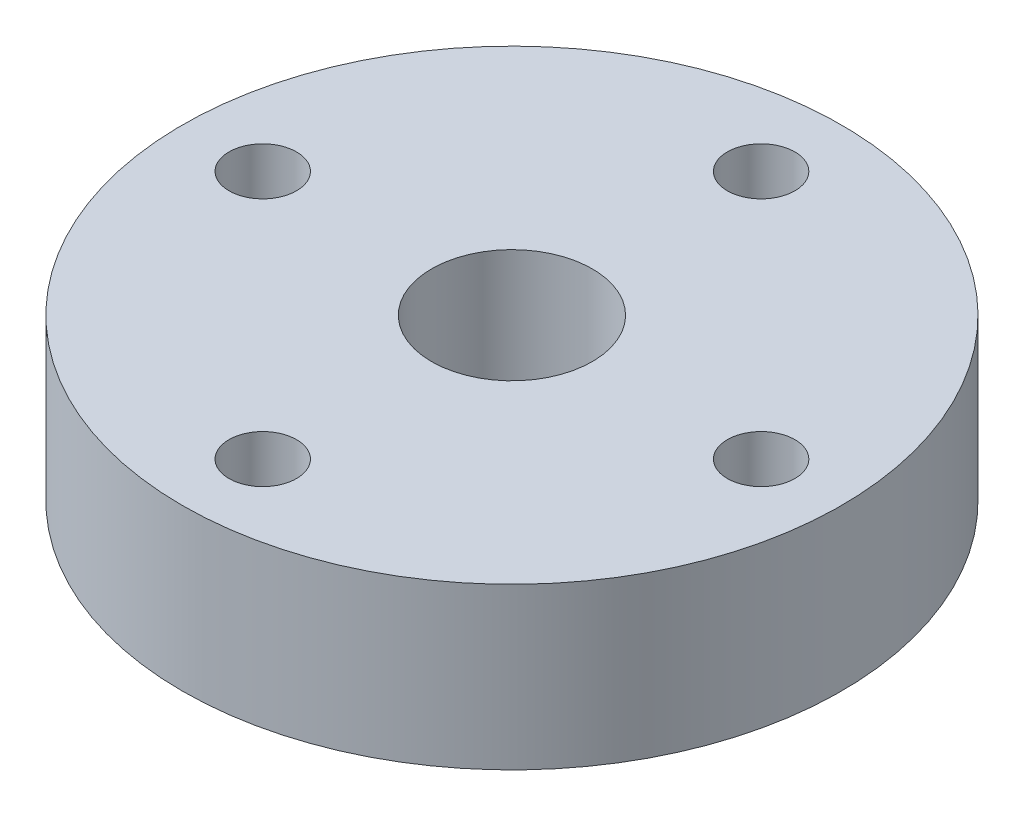
ISO-10303-21;
HEADER;
FILE_DESCRIPTION(('STEP AP214'),'2;1');
FILE_NAME('part.step','',(''),(''),'','','');
FILE_SCHEMA(('AUTOMOTIVE_DESIGN { 1 0 10303 214 1 1 1 1 }'));
ENDSEC;
DATA;
#1=APPLICATION_CONTEXT('core data for automotive mechanical design processes');
#2=APPLICATION_PROTOCOL_DEFINITION('international standard','automotive_design',2000,#1);
#3=PRODUCT_CONTEXT('',#1,'mechanical');
#4=PRODUCT('Part','Part','',(#3));
#5=PRODUCT_RELATED_PRODUCT_CATEGORY('part','',(#4));
#6=PRODUCT_DEFINITION_FORMATION('','',#4);
#7=PRODUCT_DEFINITION_CONTEXT('part definition',#1,'design');
#8=PRODUCT_DEFINITION('design','',#6,#7);
#9=PRODUCT_DEFINITION_SHAPE('','',#8);
#10=(LENGTH_UNIT() NAMED_UNIT(*) SI_UNIT(.MILLI.,.METRE.));
#11=(NAMED_UNIT(*) PLANE_ANGLE_UNIT() SI_UNIT($,.RADIAN.));
#12=(NAMED_UNIT(*) SI_UNIT($,.STERADIAN.) SOLID_ANGLE_UNIT());
#13=UNCERTAINTY_MEASURE_WITH_UNIT(LENGTH_MEASURE(1.E-05),#10,'distance_accuracy_value','');
#14=(GEOMETRIC_REPRESENTATION_CONTEXT(3) GLOBAL_UNCERTAINTY_ASSIGNED_CONTEXT((#13)) GLOBAL_UNIT_ASSIGNED_CONTEXT((#10,
#11,#12)) REPRESENTATION_CONTEXT('',''));
#15=CARTESIAN_POINT('',(0.,0.,0.));
#16=DIRECTION('',(0.,0.,1.));
#17=DIRECTION('',(1.,0.,0.));
#18=AXIS2_PLACEMENT_3D('',#15,#16,#17);
#19=CARTESIAN_POINT('',(0.,10.,0.));
#20=DIRECTION('',(0.,1.,0.));
#21=DIRECTION('',(0.,0.,1.));
#22=AXIS2_PLACEMENT_3D('',#19,#20,#21);
#23=PLANE('',#22);
#24=CARTESIAN_POINT('',(1.58665590856608E-12,10.,15.5));
#25=DIRECTION('',(0.,1.,0.));
#26=DIRECTION('',(0.,0.,1.));
#27=AXIS2_PLACEMENT_3D('',#24,#25,#26);
#28=CIRCLE('',#27,2.1);
#29=CARTESIAN_POINT('',(1.58665590856608E-12,10.,17.6));
#30=VERTEX_POINT('',#29);
#31=EDGE_CURVE('E61',#30,#30,#28,.T.);
#32=ORIENTED_EDGE('',*,*,#31,.F.);
#33=EDGE_LOOP('',(#32));
#34=FACE_BOUND('',#33,.T.);
#35=CARTESIAN_POINT('',(0.,10.,-15.5));
#36=DIRECTION('',(0.,1.,0.));
#37=DIRECTION('',(0.,0.,1.));
#38=AXIS2_PLACEMENT_3D('',#35,#36,#37);
#39=CIRCLE('',#38,2.1);
#40=CARTESIAN_POINT('',(0.,10.,-13.4));
#41=VERTEX_POINT('',#40);
#42=EDGE_CURVE('E49',#41,#41,#39,.T.);
#43=ORIENTED_EDGE('',*,*,#42,.F.);
#44=EDGE_LOOP('',(#43));
#45=FACE_BOUND('',#44,.T.);
#46=CARTESIAN_POINT('',(0.,10.,0.));
#47=DIRECTION('',(0.,1.,0.));
#48=DIRECTION('',(0.,0.,1.));
#49=AXIS2_PLACEMENT_3D('',#46,#47,#48);
#50=CIRCLE('',#49,20.5);
#51=CARTESIAN_POINT('',(0.,10.,20.5));
#52=VERTEX_POINT('',#51);
#53=EDGE_CURVE('E10',#52,#52,#50,.T.);
#54=ORIENTED_EDGE('',*,*,#53,.T.);
#55=EDGE_LOOP('',(#54));
#56=FACE_BOUND('',#55,.T.);
#57=CARTESIAN_POINT('',(0.,10.,0.));
#58=DIRECTION('',(0.,1.,0.));
#59=DIRECTION('',(0.,0.,1.));
#60=AXIS2_PLACEMENT_3D('',#57,#58,#59);
#61=CIRCLE('',#60,5.);
#62=CARTESIAN_POINT('',(0.,10.,5.));
#63=VERTEX_POINT('',#62);
#64=EDGE_CURVE('E44',#63,#63,#61,.T.);
#65=ORIENTED_EDGE('',*,*,#64,.F.);
#66=EDGE_LOOP('',(#65));
#67=FACE_BOUND('',#66,.T.);
#68=CARTESIAN_POINT('',(15.5000000000008,10.,-7.93327954283039E-13));
#69=DIRECTION('',(0.,1.,0.));
#70=DIRECTION('',(0.,0.,1.));
#71=AXIS2_PLACEMENT_3D('',#68,#69,#70);
#72=CIRCLE('',#71,2.1);
#73=CARTESIAN_POINT('',(15.5000000000008,10.,2.09999999999921));
#74=VERTEX_POINT('',#73);
#75=EDGE_CURVE('E55',#74,#74,#72,.T.);
#76=ORIENTED_EDGE('',*,*,#75,.F.);
#77=EDGE_LOOP('',(#76));
#78=FACE_BOUND('',#77,.T.);
#79=CARTESIAN_POINT('',(-15.4999999999992,10.,7.95226156821717E-13));
#80=DIRECTION('',(0.,1.,0.));
#81=DIRECTION('',(0.,0.,1.));
#82=AXIS2_PLACEMENT_3D('',#79,#80,#81);
#83=CIRCLE('',#82,2.1);
#84=CARTESIAN_POINT('',(-15.4999999999992,10.,2.10000000000079));
#85=VERTEX_POINT('',#84);
#86=EDGE_CURVE('E67',#85,#85,#83,.T.);
#87=ORIENTED_EDGE('',*,*,#86,.F.);
#88=EDGE_LOOP('',(#87));
#89=FACE_BOUND('',#88,.T.);
#90=ADVANCED_FACE('F33',(#34,#45,#56,#67,#78,#89),#23,.T.);
#91=CARTESIAN_POINT('',(0.,0.,0.));
#92=DIRECTION('',(0.,1.,0.));
#93=DIRECTION('',(0.,0.,1.));
#94=AXIS2_PLACEMENT_3D('',#91,#92,#93);
#95=PLANE('',#94);
#96=CARTESIAN_POINT('',(0.,0.,0.));
#97=DIRECTION('',(0.,1.,0.));
#98=DIRECTION('',(0.,0.,1.));
#99=AXIS2_PLACEMENT_3D('',#96,#97,#98);
#100=CIRCLE('',#99,20.5);
#101=CARTESIAN_POINT('',(0.,0.,20.5));
#102=VERTEX_POINT('',#101);
#103=EDGE_CURVE('E37',#102,#102,#100,.T.);
#104=ORIENTED_EDGE('',*,*,#103,.F.);
#105=EDGE_LOOP('',(#104));
#106=FACE_BOUND('',#105,.T.);
#107=CARTESIAN_POINT('',(0.,0.,0.));
#108=DIRECTION('',(0.,1.,0.));
#109=DIRECTION('',(0.,0.,1.));
#110=AXIS2_PLACEMENT_3D('',#107,#108,#109);
#111=CIRCLE('',#110,5.);
#112=CARTESIAN_POINT('',(0.,0.,5.));
#113=VERTEX_POINT('',#112);
#114=EDGE_CURVE('E46',#113,#113,#111,.T.);
#115=ORIENTED_EDGE('',*,*,#114,.T.);
#116=EDGE_LOOP('',(#115));
#117=FACE_BOUND('',#116,.T.);
#118=CARTESIAN_POINT('',(0.,0.,-15.5));
#119=DIRECTION('',(0.,1.,0.));
#120=DIRECTION('',(0.,0.,1.));
#121=AXIS2_PLACEMENT_3D('',#118,#119,#120);
#122=CIRCLE('',#121,2.1);
#123=CARTESIAN_POINT('',(0.,0.,-13.4));
#124=VERTEX_POINT('',#123);
#125=EDGE_CURVE('E52',#124,#124,#122,.T.);
#126=ORIENTED_EDGE('',*,*,#125,.T.);
#127=EDGE_LOOP('',(#126));
#128=FACE_BOUND('',#127,.T.);
#129=CARTESIAN_POINT('',(15.5000000000008,0.,-7.93327954283039E-13));
#130=DIRECTION('',(0.,1.,0.));
#131=DIRECTION('',(0.,0.,1.));
#132=AXIS2_PLACEMENT_3D('',#129,#130,#131);
#133=CIRCLE('',#132,2.1);
#134=CARTESIAN_POINT('',(15.5000000000008,0.,2.09999999999921));
#135=VERTEX_POINT('',#134);
#136=EDGE_CURVE('E58',#135,#135,#133,.T.);
#137=ORIENTED_EDGE('',*,*,#136,.T.);
#138=EDGE_LOOP('',(#137));
#139=FACE_BOUND('',#138,.T.);
#140=CARTESIAN_POINT('',(1.58665590856608E-12,0.,15.5));
#141=DIRECTION('',(0.,1.,0.));
#142=DIRECTION('',(0.,0.,1.));
#143=AXIS2_PLACEMENT_3D('',#140,#141,#142);
#144=CIRCLE('',#143,2.1);
#145=CARTESIAN_POINT('',(1.58665590856608E-12,0.,17.6));
#146=VERTEX_POINT('',#145);
#147=EDGE_CURVE('E64',#146,#146,#144,.T.);
#148=ORIENTED_EDGE('',*,*,#147,.T.);
#149=EDGE_LOOP('',(#148));
#150=FACE_BOUND('',#149,.T.);
#151=CARTESIAN_POINT('',(-15.4999999999992,0.,7.95226156821717E-13));
#152=DIRECTION('',(0.,1.,0.));
#153=DIRECTION('',(0.,0.,1.));
#154=AXIS2_PLACEMENT_3D('',#151,#152,#153);
#155=CIRCLE('',#154,2.1);
#156=CARTESIAN_POINT('',(-15.4999999999992,0.,2.10000000000079));
#157=VERTEX_POINT('',#156);
#158=EDGE_CURVE('E70',#157,#157,#155,.T.);
#159=ORIENTED_EDGE('',*,*,#158,.T.);
#160=EDGE_LOOP('',(#159));
#161=FACE_BOUND('',#160,.T.);
#162=ADVANCED_FACE('F80',(#106,#117,#128,#139,#150,#161),#95,.F.);
#163=CARTESIAN_POINT('',(0.,10.,0.));
#164=DIRECTION('',(0.,-1.,0.));
#165=DIRECTION('',(0.,0.,-1.));
#166=AXIS2_PLACEMENT_3D('',#163,#164,#165);
#167=CYLINDRICAL_SURFACE('',#166,20.5);
#168=ORIENTED_EDGE('',*,*,#53,.F.);
#169=EDGE_LOOP('',(#168));
#170=FACE_BOUND('',#169,.T.);
#171=ORIENTED_EDGE('',*,*,#103,.T.);
#172=EDGE_LOOP('',(#171));
#173=FACE_BOUND('',#172,.T.);
#174=ADVANCED_FACE('F35',(#170,#173),#167,.T.);
#175=CARTESIAN_POINT('',(0.,10.,0.));
#176=DIRECTION('',(0.,-1.,0.));
#177=DIRECTION('',(0.,0.,-1.));
#178=AXIS2_PLACEMENT_3D('',#175,#176,#177);
#179=CYLINDRICAL_SURFACE('',#178,5.);
#180=ORIENTED_EDGE('',*,*,#64,.T.);
#181=EDGE_LOOP('',(#180));
#182=FACE_BOUND('',#181,.T.);
#183=ORIENTED_EDGE('',*,*,#114,.F.);
#184=EDGE_LOOP('',(#183));
#185=FACE_BOUND('',#184,.T.);
#186=ADVANCED_FACE('F90',(#182,#185),#179,.F.);
#187=CARTESIAN_POINT('',(0.,10.,-15.5));
#188=DIRECTION('',(0.,-1.,0.));
#189=DIRECTION('',(0.,0.,-1.));
#190=AXIS2_PLACEMENT_3D('',#187,#188,#189);
#191=CYLINDRICAL_SURFACE('',#190,2.1);
#192=ORIENTED_EDGE('',*,*,#42,.T.);
#193=EDGE_LOOP('',(#192));
#194=FACE_BOUND('',#193,.T.);
#195=ORIENTED_EDGE('',*,*,#125,.F.);
#196=EDGE_LOOP('',(#195));
#197=FACE_BOUND('',#196,.T.);
#198=ADVANCED_FACE('F93',(#194,#197),#191,.F.);
#199=CARTESIAN_POINT('',(15.5000000000008,10.,-7.93327954283039E-13));
#200=DIRECTION('',(0.,-1.,0.));
#201=DIRECTION('',(0.,0.,-1.));
#202=AXIS2_PLACEMENT_3D('',#199,#200,#201);
#203=CYLINDRICAL_SURFACE('',#202,2.1);
#204=ORIENTED_EDGE('',*,*,#75,.T.);
#205=EDGE_LOOP('',(#204));
#206=FACE_BOUND('',#205,.T.);
#207=ORIENTED_EDGE('',*,*,#136,.F.);
#208=EDGE_LOOP('',(#207));
#209=FACE_BOUND('',#208,.T.);
#210=ADVANCED_FACE('F97',(#206,#209),#203,.F.);
#211=CARTESIAN_POINT('',(1.58665590856608E-12,10.,15.5));
#212=DIRECTION('',(0.,-1.,0.));
#213=DIRECTION('',(0.,0.,-1.));
#214=AXIS2_PLACEMENT_3D('',#211,#212,#213);
#215=CYLINDRICAL_SURFACE('',#214,2.1);
#216=ORIENTED_EDGE('',*,*,#31,.T.);
#217=EDGE_LOOP('',(#216));
#218=FACE_BOUND('',#217,.T.);
#219=ORIENTED_EDGE('',*,*,#147,.F.);
#220=EDGE_LOOP('',(#219));
#221=FACE_BOUND('',#220,.T.);
#222=ADVANCED_FACE('F101',(#218,#221),#215,.F.);
#223=CARTESIAN_POINT('',(-15.4999999999992,10.,7.95226156821717E-13));
#224=DIRECTION('',(0.,-1.,0.));
#225=DIRECTION('',(0.,0.,-1.));
#226=AXIS2_PLACEMENT_3D('',#223,#224,#225);
#227=CYLINDRICAL_SURFACE('',#226,2.1);
#228=ORIENTED_EDGE('',*,*,#86,.T.);
#229=EDGE_LOOP('',(#228));
#230=FACE_BOUND('',#229,.T.);
#231=ORIENTED_EDGE('',*,*,#158,.F.);
#232=EDGE_LOOP('',(#231));
#233=FACE_BOUND('',#232,.T.);
#234=ADVANCED_FACE('F76',(#230,#233),#227,.F.);
#235=CLOSED_SHELL('',(#90,#162,#174,#186,#198,#210,#222,#234));
#236=MANIFOLD_SOLID_BREP('B2',#235);
#237=ADVANCED_BREP_SHAPE_REPRESENTATION('',(#18,#236),#14);
#238=SHAPE_DEFINITION_REPRESENTATION(#9,#237);
ENDSEC;
END-ISO-10303-21;
